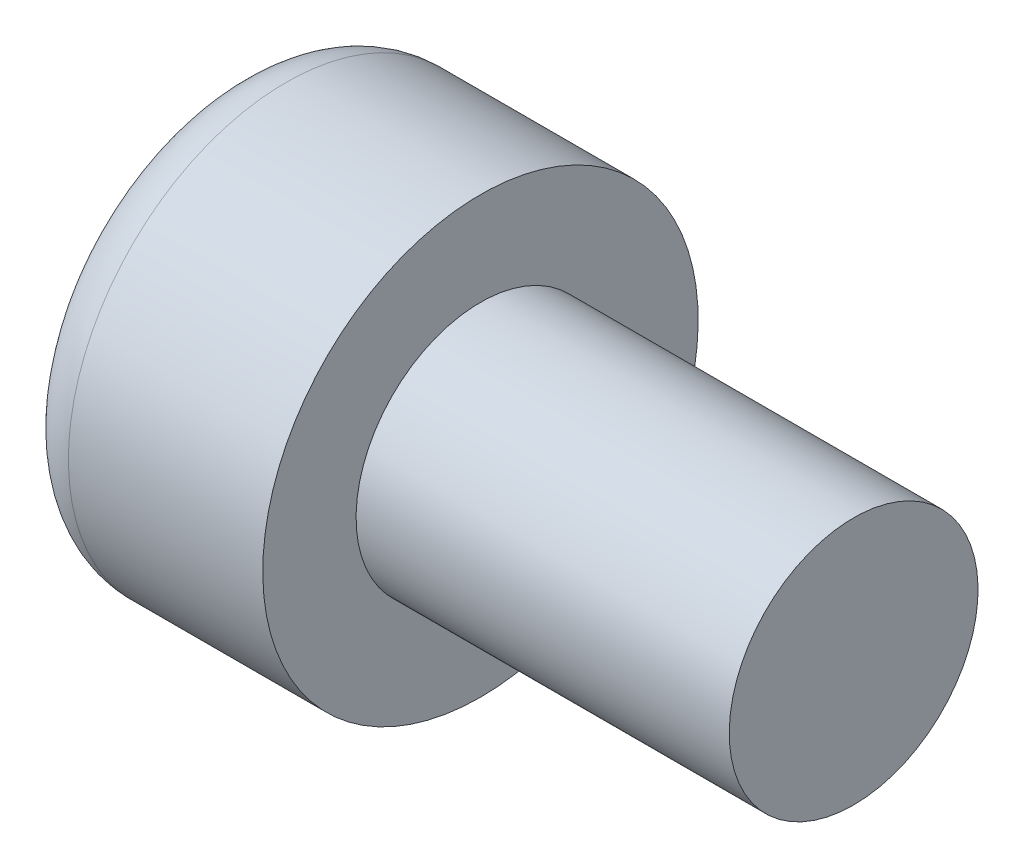
ISO-10303-21;
HEADER;
FILE_DESCRIPTION(('STEP AP214'),'2;1');
FILE_NAME('part.step','',(''),(''),'','','');
FILE_SCHEMA(('AUTOMOTIVE_DESIGN { 1 0 10303 214 1 1 1 1 }'));
ENDSEC;
DATA;
#1=APPLICATION_CONTEXT('core data for automotive mechanical design processes');
#2=APPLICATION_PROTOCOL_DEFINITION('international standard','automotive_design',2000,#1);
#3=PRODUCT_CONTEXT('',#1,'mechanical');
#4=PRODUCT('Part','Part','',(#3));
#5=PRODUCT_RELATED_PRODUCT_CATEGORY('part','',(#4));
#6=PRODUCT_DEFINITION_FORMATION('','',#4);
#7=PRODUCT_DEFINITION_CONTEXT('part definition',#1,'design');
#8=PRODUCT_DEFINITION('design','',#6,#7);
#9=PRODUCT_DEFINITION_SHAPE('','',#8);
#10=(LENGTH_UNIT() NAMED_UNIT(*) SI_UNIT(.MILLI.,.METRE.));
#11=(NAMED_UNIT(*) PLANE_ANGLE_UNIT() SI_UNIT($,.RADIAN.));
#12=(NAMED_UNIT(*) SI_UNIT($,.STERADIAN.) SOLID_ANGLE_UNIT());
#13=UNCERTAINTY_MEASURE_WITH_UNIT(LENGTH_MEASURE(1.E-05),#10,'distance_accuracy_value','');
#14=(GEOMETRIC_REPRESENTATION_CONTEXT(3) GLOBAL_UNCERTAINTY_ASSIGNED_CONTEXT((#13)) GLOBAL_UNIT_ASSIGNED_CONTEXT((#10,
#11,#12)) REPRESENTATION_CONTEXT('',''));
#15=CARTESIAN_POINT('',(0.,0.,0.));
#16=DIRECTION('',(0.,0.,1.));
#17=DIRECTION('',(1.,0.,0.));
#18=AXIS2_PLACEMENT_3D('',#15,#16,#17);
#19=CARTESIAN_POINT('',(0.,0.,0.));
#20=DIRECTION('',(1.,0.,0.));
#21=DIRECTION('',(0.,1.,0.));
#22=AXIS2_PLACEMENT_3D('',#19,#20,#21);
#23=PLANE('',#22);
#24=DIRECTION('',(0.,-0.5,-0.866025403784439));
#25=VECTOR('',#24,1.);
#26=CARTESIAN_POINT('',(0.,1.73205080756888,0.));
#27=LINE('',#26,#25);
#28=CARTESIAN_POINT('',(0.,1.73205080756888,0.));
#29=VERTEX_POINT('',#28);
#30=CARTESIAN_POINT('',(0.,0.866025403784439,-1.5));
#31=VERTEX_POINT('',#30);
#32=EDGE_CURVE('E121',#29,#31,#27,.T.);
#33=ORIENTED_EDGE('',*,*,#32,.F.);
#34=DIRECTION('',(0.,0.5,-0.866025403784439));
#35=VECTOR('',#34,1.);
#36=CARTESIAN_POINT('',(0.,0.866025403784439,1.5));
#37=LINE('',#36,#35);
#38=CARTESIAN_POINT('',(0.,0.866025403784439,1.5));
#39=VERTEX_POINT('',#38);
#40=EDGE_CURVE('E47',#39,#29,#37,.T.);
#41=ORIENTED_EDGE('',*,*,#40,.F.);
#42=DIRECTION('',(0.,1.,0.));
#43=VECTOR('',#42,1.);
#44=CARTESIAN_POINT('',(0.,-0.866025403784439,1.5));
#45=LINE('',#44,#43);
#46=CARTESIAN_POINT('',(0.,-0.866025403784439,1.5));
#47=VERTEX_POINT('',#46);
#48=EDGE_CURVE('E130',#47,#39,#45,.T.);
#49=ORIENTED_EDGE('',*,*,#48,.F.);
#50=DIRECTION('',(0.,0.5,0.866025403784439));
#51=VECTOR('',#50,1.);
#52=CARTESIAN_POINT('',(0.,-1.73205080756888,0.));
#53=LINE('',#52,#51);
#54=CARTESIAN_POINT('',(0.,-1.73205080756888,0.));
#55=VERTEX_POINT('',#54);
#56=EDGE_CURVE('E128',#55,#47,#53,.T.);
#57=ORIENTED_EDGE('',*,*,#56,.F.);
#58=DIRECTION('',(0.,-0.5,0.866025403784439));
#59=VECTOR('',#58,1.);
#60=CARTESIAN_POINT('',(0.,-0.866025403784439,-1.5));
#61=LINE('',#60,#59);
#62=CARTESIAN_POINT('',(0.,-0.866025403784439,-1.5));
#63=VERTEX_POINT('',#62);
#64=EDGE_CURVE('E95',#63,#55,#61,.T.);
#65=ORIENTED_EDGE('',*,*,#64,.F.);
#66=DIRECTION('',(0.,-1.,0.));
#67=VECTOR('',#66,1.);
#68=CARTESIAN_POINT('',(0.,0.866025403784439,-1.5));
#69=LINE('',#68,#67);
#70=EDGE_CURVE('E124',#31,#63,#69,.T.);
#71=ORIENTED_EDGE('',*,*,#70,.F.);
#72=EDGE_LOOP('',(#33,#41,#49,#57,#65,#71));
#73=FACE_BOUND('',#72,.T.);
#74=CARTESIAN_POINT('',(0.,0.,0.));
#75=DIRECTION('',(-1.,0.,0.));
#76=DIRECTION('',(0.,-1.,0.));
#77=AXIS2_PLACEMENT_3D('',#74,#75,#76);
#78=CIRCLE('',#77,2.625);
#79=CARTESIAN_POINT('',(0.,-2.625,0.));
#80=VERTEX_POINT('',#79);
#81=EDGE_CURVE('E11',#80,#80,#78,.T.);
#82=ORIENTED_EDGE('',*,*,#81,.T.);
#83=EDGE_LOOP('',(#82));
#84=FACE_BOUND('',#83,.T.);
#85=ADVANCED_FACE('F33',(#73,#84),#23,.F.);
#86=CARTESIAN_POINT('',(0.875,0.,0.));
#87=DIRECTION('',(-1.,0.,0.));
#88=DIRECTION('',(0.,-1.,0.));
#89=AXIS2_PLACEMENT_3D('',#86,#87,#88);
#90=TOROIDAL_SURFACE('',#89,2.625,0.875);
#91=ORIENTED_EDGE('',*,*,#81,.F.);
#92=EDGE_LOOP('',(#91));
#93=FACE_BOUND('',#92,.T.);
#94=CARTESIAN_POINT('',(0.875,0.,0.));
#95=DIRECTION('',(-1.,0.,0.));
#96=DIRECTION('',(0.,-1.,0.));
#97=AXIS2_PLACEMENT_3D('',#94,#95,#96);
#98=CIRCLE('',#97,3.5);
#99=CARTESIAN_POINT('',(0.875000000000001,-3.5,0.));
#100=VERTEX_POINT('',#99);
#101=EDGE_CURVE('E40',#100,#100,#98,.T.);
#102=ORIENTED_EDGE('',*,*,#101,.T.);
#103=EDGE_LOOP('',(#102));
#104=FACE_BOUND('',#103,.T.);
#105=ADVANCED_FACE('F150',(#93,#104),#90,.T.);
#106=CARTESIAN_POINT('',(0.,0.,0.));
#107=DIRECTION('',(-1.,0.,0.));
#108=DIRECTION('',(0.,-1.,0.));
#109=AXIS2_PLACEMENT_3D('',#106,#107,#108);
#110=CYLINDRICAL_SURFACE('',#109,3.5);
#111=ORIENTED_EDGE('',*,*,#101,.F.);
#112=EDGE_LOOP('',(#111));
#113=FACE_BOUND('',#112,.T.);
#114=CARTESIAN_POINT('',(4.,0.,0.));
#115=DIRECTION('',(-1.,0.,0.));
#116=DIRECTION('',(0.,-1.,0.));
#117=AXIS2_PLACEMENT_3D('',#114,#115,#116);
#118=CIRCLE('',#117,3.5);
#119=CARTESIAN_POINT('',(4.,-3.5,0.));
#120=VERTEX_POINT('',#119);
#121=EDGE_CURVE('E145',#120,#120,#118,.T.);
#122=ORIENTED_EDGE('',*,*,#121,.T.);
#123=EDGE_LOOP('',(#122));
#124=FACE_BOUND('',#123,.T.);
#125=ADVANCED_FACE('F152',(#113,#124),#110,.T.);
#126=CARTESIAN_POINT('',(4.,3.5,0.));
#127=DIRECTION('',(-1.,0.,0.));
#128=DIRECTION('',(0.,-1.,0.));
#129=AXIS2_PLACEMENT_3D('',#126,#127,#128);
#130=PLANE('',#129);
#131=ORIENTED_EDGE('',*,*,#121,.F.);
#132=EDGE_LOOP('',(#131));
#133=FACE_BOUND('',#132,.T.);
#134=CARTESIAN_POINT('',(4.,0.,0.));
#135=DIRECTION('',(-1.,0.,0.));
#136=DIRECTION('',(0.,-1.,0.));
#137=AXIS2_PLACEMENT_3D('',#134,#135,#136);
#138=CIRCLE('',#137,2.);
#139=CARTESIAN_POINT('',(4.,-2.,0.));
#140=VERTEX_POINT('',#139);
#141=EDGE_CURVE('E142',#140,#140,#138,.T.);
#142=ORIENTED_EDGE('',*,*,#141,.T.);
#143=EDGE_LOOP('',(#142));
#144=FACE_BOUND('',#143,.T.);
#145=ADVANCED_FACE('F155',(#133,#144),#130,.F.);
#146=CARTESIAN_POINT('',(0.,0.,0.));
#147=DIRECTION('',(-1.,0.,0.));
#148=DIRECTION('',(0.,-1.,0.));
#149=AXIS2_PLACEMENT_3D('',#146,#147,#148);
#150=CYLINDRICAL_SURFACE('',#149,2.);
#151=ORIENTED_EDGE('',*,*,#141,.F.);
#152=EDGE_LOOP('',(#151));
#153=FACE_BOUND('',#152,.T.);
#154=CARTESIAN_POINT('',(10.,0.,0.));
#155=DIRECTION('',(-1.,0.,0.));
#156=DIRECTION('',(0.,-1.,0.));
#157=AXIS2_PLACEMENT_3D('',#154,#155,#156);
#158=CIRCLE('',#157,2.);
#159=CARTESIAN_POINT('',(10.,-2.,0.));
#160=VERTEX_POINT('',#159);
#161=EDGE_CURVE('E134',#160,#160,#158,.T.);
#162=ORIENTED_EDGE('',*,*,#161,.T.);
#163=EDGE_LOOP('',(#162));
#164=FACE_BOUND('',#163,.T.);
#165=ADVANCED_FACE('F161',(#153,#164),#150,.T.);
#166=CARTESIAN_POINT('',(10.,2.,0.));
#167=DIRECTION('',(-1.,0.,0.));
#168=DIRECTION('',(0.,-1.,0.));
#169=AXIS2_PLACEMENT_3D('',#166,#167,#168);
#170=PLANE('',#169);
#171=ORIENTED_EDGE('',*,*,#161,.F.);
#172=EDGE_LOOP('',(#171));
#173=FACE_BOUND('',#172,.T.);
#174=ADVANCED_FACE('F167',(#173),#170,.F.);
#175=CARTESIAN_POINT('',(2.,0.866025403784439,1.5));
#176=DIRECTION('',(0.,0.866025403784439,0.5));
#177=DIRECTION('',(0.,-0.5,0.866025403784439));
#178=AXIS2_PLACEMENT_3D('',#175,#176,#177);
#179=PLANE('',#178);
#180=ORIENTED_EDGE('',*,*,#40,.T.);
#181=DIRECTION('',(-1.,0.,0.));
#182=VECTOR('',#181,1.);
#183=CARTESIAN_POINT('',(2.,1.73205080756888,0.));
#184=LINE('',#183,#182);
#185=CARTESIAN_POINT('',(2.,1.73205080756888,0.));
#186=VERTEX_POINT('',#185);
#187=EDGE_CURVE('E77',#186,#29,#184,.T.);
#188=ORIENTED_EDGE('',*,*,#187,.F.);
#189=DIRECTION('',(0.,0.5,-0.866025403784439));
#190=VECTOR('',#189,1.);
#191=CARTESIAN_POINT('',(2.,0.866025403784439,1.5));
#192=LINE('',#191,#190);
#193=CARTESIAN_POINT('',(2.,0.866025403784439,1.5));
#194=VERTEX_POINT('',#193);
#195=EDGE_CURVE('E132',#194,#186,#192,.T.);
#196=ORIENTED_EDGE('',*,*,#195,.F.);
#197=DIRECTION('',(-1.,0.,0.));
#198=VECTOR('',#197,1.);
#199=CARTESIAN_POINT('',(2.,0.866025403784439,1.5));
#200=LINE('',#199,#198);
#201=EDGE_CURVE('E55',#194,#39,#200,.T.);
#202=ORIENTED_EDGE('',*,*,#201,.T.);
#203=EDGE_LOOP('',(#180,#188,#196,#202));
#204=FACE_BOUND('',#203,.T.);
#205=ADVANCED_FACE('F172',(#204),#179,.F.);
#206=CARTESIAN_POINT('',(2.,-0.866025403784439,1.5));
#207=DIRECTION('',(0.,0.,1.));
#208=DIRECTION('',(0.,-1.,0.));
#209=AXIS2_PLACEMENT_3D('',#206,#207,#208);
#210=PLANE('',#209);
#211=ORIENTED_EDGE('',*,*,#48,.T.);
#212=ORIENTED_EDGE('',*,*,#201,.F.);
#213=DIRECTION('',(0.,1.,0.));
#214=VECTOR('',#213,1.);
#215=CARTESIAN_POINT('',(2.,-0.866025403784439,1.5));
#216=LINE('',#215,#214);
#217=CARTESIAN_POINT('',(2.,-0.866025403784439,1.5));
#218=VERTEX_POINT('',#217);
#219=EDGE_CURVE('E107',#218,#194,#216,.T.);
#220=ORIENTED_EDGE('',*,*,#219,.F.);
#221=DIRECTION('',(-1.,0.,0.));
#222=VECTOR('',#221,1.);
#223=CARTESIAN_POINT('',(2.,-0.866025403784439,1.5));
#224=LINE('',#223,#222);
#225=EDGE_CURVE('E99',#218,#47,#224,.T.);
#226=ORIENTED_EDGE('',*,*,#225,.T.);
#227=EDGE_LOOP('',(#211,#212,#220,#226));
#228=FACE_BOUND('',#227,.T.);
#229=ADVANCED_FACE('F177',(#228),#210,.F.);
#230=CARTESIAN_POINT('',(2.,-1.73205080756888,0.));
#231=DIRECTION('',(0.,-0.866025403784439,0.5));
#232=DIRECTION('',(0.,-0.5,-0.866025403784439));
#233=AXIS2_PLACEMENT_3D('',#230,#231,#232);
#234=PLANE('',#233);
#235=ORIENTED_EDGE('',*,*,#56,.T.);
#236=ORIENTED_EDGE('',*,*,#225,.F.);
#237=DIRECTION('',(0.,0.5,0.866025403784439));
#238=VECTOR('',#237,1.);
#239=CARTESIAN_POINT('',(2.,-1.73205080756888,0.));
#240=LINE('',#239,#238);
#241=CARTESIAN_POINT('',(2.,-1.73205080756888,0.));
#242=VERTEX_POINT('',#241);
#243=EDGE_CURVE('E103',#242,#218,#240,.T.);
#244=ORIENTED_EDGE('',*,*,#243,.F.);
#245=DIRECTION('',(-1.,0.,0.));
#246=VECTOR('',#245,1.);
#247=CARTESIAN_POINT('',(2.,-1.73205080756888,0.));
#248=LINE('',#247,#246);
#249=EDGE_CURVE('E88',#242,#55,#248,.T.);
#250=ORIENTED_EDGE('',*,*,#249,.T.);
#251=EDGE_LOOP('',(#235,#236,#244,#250));
#252=FACE_BOUND('',#251,.T.);
#253=ADVANCED_FACE('F104',(#252),#234,.F.);
#254=CARTESIAN_POINT('',(2.,-0.866025403784439,-1.5));
#255=DIRECTION('',(0.,-0.866025403784439,-0.5));
#256=DIRECTION('',(0.,0.5,-0.866025403784439));
#257=AXIS2_PLACEMENT_3D('',#254,#255,#256);
#258=PLANE('',#257);
#259=ORIENTED_EDGE('',*,*,#64,.T.);
#260=ORIENTED_EDGE('',*,*,#249,.F.);
#261=DIRECTION('',(0.,-0.5,0.866025403784439));
#262=VECTOR('',#261,1.);
#263=CARTESIAN_POINT('',(2.,-0.866025403784439,-1.5));
#264=LINE('',#263,#262);
#265=CARTESIAN_POINT('',(2.,-0.866025403784439,-1.5));
#266=VERTEX_POINT('',#265);
#267=EDGE_CURVE('E92',#266,#242,#264,.T.);
#268=ORIENTED_EDGE('',*,*,#267,.F.);
#269=DIRECTION('',(-1.,0.,0.));
#270=VECTOR('',#269,1.);
#271=CARTESIAN_POINT('',(2.,-0.866025403784439,-1.5));
#272=LINE('',#271,#270);
#273=EDGE_CURVE('E100',#266,#63,#272,.T.);
#274=ORIENTED_EDGE('',*,*,#273,.T.);
#275=EDGE_LOOP('',(#259,#260,#268,#274));
#276=FACE_BOUND('',#275,.T.);
#277=ADVANCED_FACE('F90',(#276),#258,.F.);
#278=CARTESIAN_POINT('',(2.,0.866025403784439,-1.5));
#279=DIRECTION('',(0.,0.,-1.));
#280=DIRECTION('',(-1.,0.,0.));
#281=AXIS2_PLACEMENT_3D('',#278,#279,#280);
#282=PLANE('',#281);
#283=ORIENTED_EDGE('',*,*,#70,.T.);
#284=ORIENTED_EDGE('',*,*,#273,.F.);
#285=DIRECTION('',(0.,-1.,0.));
#286=VECTOR('',#285,1.);
#287=CARTESIAN_POINT('',(2.,0.866025403784439,-1.5));
#288=LINE('',#287,#286);
#289=CARTESIAN_POINT('',(2.,0.866025403784439,-1.5));
#290=VERTEX_POINT('',#289);
#291=EDGE_CURVE('E113',#290,#266,#288,.T.);
#292=ORIENTED_EDGE('',*,*,#291,.F.);
#293=DIRECTION('',(-1.,0.,0.));
#294=VECTOR('',#293,1.);
#295=CARTESIAN_POINT('',(2.,0.866025403784439,-1.5));
#296=LINE('',#295,#294);
#297=EDGE_CURVE('E137',#290,#31,#296,.T.);
#298=ORIENTED_EDGE('',*,*,#297,.T.);
#299=EDGE_LOOP('',(#283,#284,#292,#298));
#300=FACE_BOUND('',#299,.T.);
#301=ADVANCED_FACE('F203',(#300),#282,.F.);
#302=CARTESIAN_POINT('',(2.,1.73205080756888,0.));
#303=DIRECTION('',(0.,0.866025403784439,-0.5));
#304=DIRECTION('',(0.,0.5,0.866025403784439));
#305=AXIS2_PLACEMENT_3D('',#302,#303,#304);
#306=PLANE('',#305);
#307=ORIENTED_EDGE('',*,*,#32,.T.);
#308=ORIENTED_EDGE('',*,*,#297,.F.);
#309=DIRECTION('',(0.,-0.5,-0.866025403784439));
#310=VECTOR('',#309,1.);
#311=CARTESIAN_POINT('',(2.,1.73205080756888,0.));
#312=LINE('',#311,#310);
#313=EDGE_CURVE('E115',#186,#290,#312,.T.);
#314=ORIENTED_EDGE('',*,*,#313,.F.);
#315=ORIENTED_EDGE('',*,*,#187,.T.);
#316=EDGE_LOOP('',(#307,#308,#314,#315));
#317=FACE_BOUND('',#316,.T.);
#318=ADVANCED_FACE('F191',(#317),#306,.F.);
#319=CARTESIAN_POINT('',(2.,0.,0.));
#320=DIRECTION('',(-1.,0.,0.));
#321=DIRECTION('',(0.,-1.,0.));
#322=AXIS2_PLACEMENT_3D('',#319,#320,#321);
#323=PLANE('',#322);
#324=ORIENTED_EDGE('',*,*,#195,.T.);
#325=ORIENTED_EDGE('',*,*,#313,.T.);
#326=ORIENTED_EDGE('',*,*,#291,.T.);
#327=ORIENTED_EDGE('',*,*,#267,.T.);
#328=ORIENTED_EDGE('',*,*,#243,.T.);
#329=ORIENTED_EDGE('',*,*,#219,.T.);
#330=EDGE_LOOP('',(#324,#325,#326,#327,#328,#329));
#331=FACE_BOUND('',#330,.T.);
#332=ADVANCED_FACE('F110',(#331),#323,.T.);
#333=CLOSED_SHELL('',(#85,#105,#125,#145,#165,#174,#205,#229,#253,#277,#301,#318,#332));
#334=MANIFOLD_SOLID_BREP('B2',#333);
#335=ADVANCED_BREP_SHAPE_REPRESENTATION('',(#18,#334),#14);
#336=SHAPE_DEFINITION_REPRESENTATION(#9,#335);
ENDSEC;
END-ISO-10303-21;
